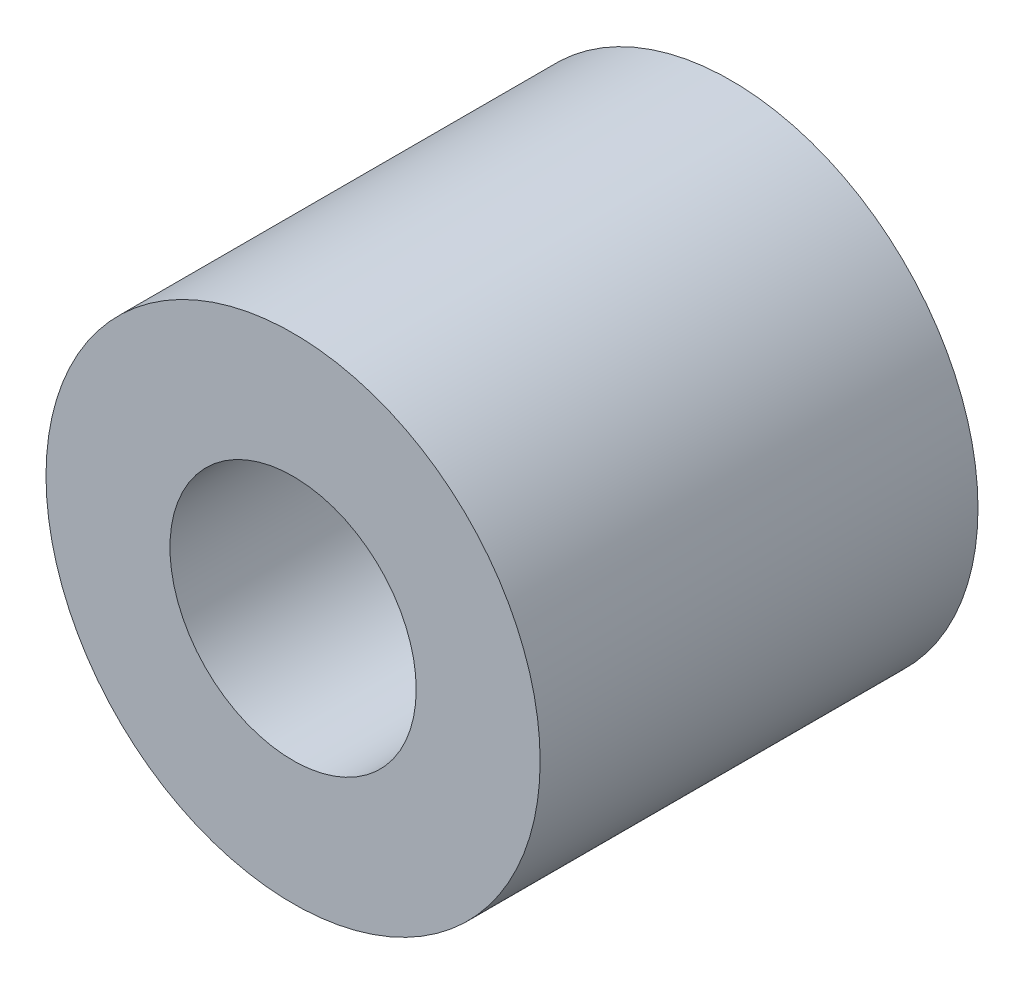
ISO-10303-21;
HEADER;
FILE_DESCRIPTION(('STEP AP214'),'2;1');
FILE_NAME('part.step','',(''),(''),'','','');
FILE_SCHEMA(('AUTOMOTIVE_DESIGN { 1 0 10303 214 1 1 1 1 }'));
ENDSEC;
DATA;
#1=APPLICATION_CONTEXT('core data for automotive mechanical design processes');
#2=APPLICATION_PROTOCOL_DEFINITION('international standard','automotive_design',2000,#1);
#3=PRODUCT_CONTEXT('',#1,'mechanical');
#4=PRODUCT('Part','Part','',(#3));
#5=PRODUCT_RELATED_PRODUCT_CATEGORY('part','',(#4));
#6=PRODUCT_DEFINITION_FORMATION('','',#4);
#7=PRODUCT_DEFINITION_CONTEXT('part definition',#1,'design');
#8=PRODUCT_DEFINITION('design','',#6,#7);
#9=PRODUCT_DEFINITION_SHAPE('','',#8);
#10=(LENGTH_UNIT() NAMED_UNIT(*) SI_UNIT(.MILLI.,.METRE.));
#11=(NAMED_UNIT(*) PLANE_ANGLE_UNIT() SI_UNIT($,.RADIAN.));
#12=(NAMED_UNIT(*) SI_UNIT($,.STERADIAN.) SOLID_ANGLE_UNIT());
#13=UNCERTAINTY_MEASURE_WITH_UNIT(LENGTH_MEASURE(1.E-05),#10,'distance_accuracy_value','');
#14=(GEOMETRIC_REPRESENTATION_CONTEXT(3) GLOBAL_UNCERTAINTY_ASSIGNED_CONTEXT((#13)) GLOBAL_UNIT_ASSIGNED_CONTEXT((#10,
#11,#12)) REPRESENTATION_CONTEXT('',''));
#15=CARTESIAN_POINT('',(0.,0.,0.));
#16=DIRECTION('',(0.,0.,1.));
#17=DIRECTION('',(1.,0.,0.));
#18=AXIS2_PLACEMENT_3D('',#15,#16,#17);
#19=CARTESIAN_POINT('',(0.,0.,4.445));
#20=DIRECTION('',(0.,0.,1.));
#21=DIRECTION('',(1.,0.,0.));
#22=AXIS2_PLACEMENT_3D('',#19,#20,#21);
#23=PLANE('',#22);
#24=CARTESIAN_POINT('',(0.,0.,4.445));
#25=DIRECTION('',(0.,0.,1.));
#26=DIRECTION('',(1.,0.,0.));
#27=AXIS2_PLACEMENT_3D('',#24,#25,#26);
#28=CIRCLE('',#27,5.0165);
#29=CARTESIAN_POINT('',(5.0165,0.,4.445));
#30=VERTEX_POINT('',#29);
#31=EDGE_CURVE('E10',#30,#30,#28,.T.);
#32=ORIENTED_EDGE('',*,*,#31,.T.);
#33=EDGE_LOOP('',(#32));
#34=FACE_BOUND('',#33,.T.);
#35=CARTESIAN_POINT('',(0.,0.,4.445));
#36=DIRECTION('',(0.,0.,1.));
#37=DIRECTION('',(1.,0.,0.));
#38=AXIS2_PLACEMENT_3D('',#35,#36,#37);
#39=CIRCLE('',#38,2.5);
#40=CARTESIAN_POINT('',(2.5,0.,4.445));
#41=VERTEX_POINT('',#40);
#42=EDGE_CURVE('E42',#41,#41,#39,.T.);
#43=ORIENTED_EDGE('',*,*,#42,.F.);
#44=EDGE_LOOP('',(#43));
#45=FACE_BOUND('',#44,.T.);
#46=ADVANCED_FACE('F31',(#34,#45),#23,.T.);
#47=CARTESIAN_POINT('',(0.,0.,-4.445));
#48=DIRECTION('',(0.,0.,1.));
#49=DIRECTION('',(1.,0.,0.));
#50=AXIS2_PLACEMENT_3D('',#47,#48,#49);
#51=PLANE('',#50);
#52=CARTESIAN_POINT('',(0.,0.,-4.445));
#53=DIRECTION('',(0.,0.,1.));
#54=DIRECTION('',(1.,0.,0.));
#55=AXIS2_PLACEMENT_3D('',#52,#53,#54);
#56=CIRCLE('',#55,5.0165);
#57=CARTESIAN_POINT('',(5.0165,0.,-4.445));
#58=VERTEX_POINT('',#57);
#59=EDGE_CURVE('E35',#58,#58,#56,.T.);
#60=ORIENTED_EDGE('',*,*,#59,.F.);
#61=EDGE_LOOP('',(#60));
#62=FACE_BOUND('',#61,.T.);
#63=CARTESIAN_POINT('',(0.,0.,-4.445));
#64=DIRECTION('',(0.,0.,1.));
#65=DIRECTION('',(1.,0.,0.));
#66=AXIS2_PLACEMENT_3D('',#63,#64,#65);
#67=CIRCLE('',#66,2.5);
#68=CARTESIAN_POINT('',(2.5,0.,-4.445));
#69=VERTEX_POINT('',#68);
#70=EDGE_CURVE('E44',#69,#69,#67,.T.);
#71=ORIENTED_EDGE('',*,*,#70,.T.);
#72=EDGE_LOOP('',(#71));
#73=FACE_BOUND('',#72,.T.);
#74=ADVANCED_FACE('F54',(#62,#73),#51,.F.);
#75=CARTESIAN_POINT('',(0.,0.,4.445));
#76=DIRECTION('',(0.,0.,-1.));
#77=DIRECTION('',(-1.,0.,0.));
#78=AXIS2_PLACEMENT_3D('',#75,#76,#77);
#79=CYLINDRICAL_SURFACE('',#78,5.0165);
#80=ORIENTED_EDGE('',*,*,#31,.F.);
#81=EDGE_LOOP('',(#80));
#82=FACE_BOUND('',#81,.T.);
#83=ORIENTED_EDGE('',*,*,#59,.T.);
#84=EDGE_LOOP('',(#83));
#85=FACE_BOUND('',#84,.T.);
#86=ADVANCED_FACE('F33',(#82,#85),#79,.T.);
#87=CARTESIAN_POINT('',(0.,0.,4.445));
#88=DIRECTION('',(0.,0.,-1.));
#89=DIRECTION('',(-1.,0.,0.));
#90=AXIS2_PLACEMENT_3D('',#87,#88,#89);
#91=CYLINDRICAL_SURFACE('',#90,2.5);
#92=ORIENTED_EDGE('',*,*,#42,.T.);
#93=EDGE_LOOP('',(#92));
#94=FACE_BOUND('',#93,.T.);
#95=ORIENTED_EDGE('',*,*,#70,.F.);
#96=EDGE_LOOP('',(#95));
#97=FACE_BOUND('',#96,.T.);
#98=ADVANCED_FACE('F50',(#94,#97),#91,.F.);
#99=CLOSED_SHELL('',(#46,#74,#86,#98));
#100=MANIFOLD_SOLID_BREP('B2',#99);
#101=ADVANCED_BREP_SHAPE_REPRESENTATION('',(#18,#100),#14);
#102=SHAPE_DEFINITION_REPRESENTATION(#9,#101);
ENDSEC;
END-ISO-10303-21;
